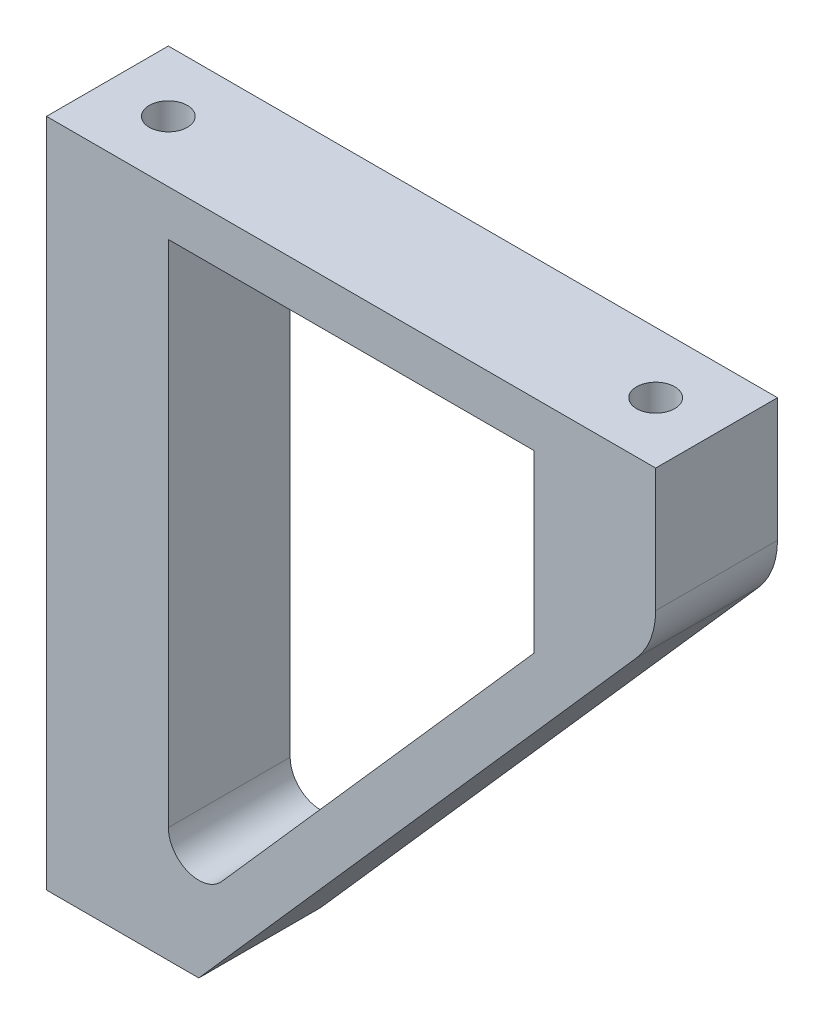
ISO-10303-21;
HEADER;
FILE_DESCRIPTION(('STEP AP214'),'2;1');
FILE_NAME('part.step','',(''),(''),'','','');
FILE_SCHEMA(('AUTOMOTIVE_DESIGN { 1 0 10303 214 1 1 1 1 }'));
ENDSEC;
DATA;
#1=APPLICATION_CONTEXT('core data for automotive mechanical design processes');
#2=APPLICATION_PROTOCOL_DEFINITION('international standard','automotive_design',2000,#1);
#3=PRODUCT_CONTEXT('',#1,'mechanical');
#4=PRODUCT('Part','Part','',(#3));
#5=PRODUCT_RELATED_PRODUCT_CATEGORY('part','',(#4));
#6=PRODUCT_DEFINITION_FORMATION('','',#4);
#7=PRODUCT_DEFINITION_CONTEXT('part definition',#1,'design');
#8=PRODUCT_DEFINITION('design','',#6,#7);
#9=PRODUCT_DEFINITION_SHAPE('','',#8);
#10=(LENGTH_UNIT() NAMED_UNIT(*) SI_UNIT(.MILLI.,.METRE.));
#11=(NAMED_UNIT(*) PLANE_ANGLE_UNIT() SI_UNIT($,.RADIAN.));
#12=(NAMED_UNIT(*) SI_UNIT($,.STERADIAN.) SOLID_ANGLE_UNIT());
#13=UNCERTAINTY_MEASURE_WITH_UNIT(LENGTH_MEASURE(1.E-05),#10,'distance_accuracy_value','');
#14=(GEOMETRIC_REPRESENTATION_CONTEXT(3) GLOBAL_UNCERTAINTY_ASSIGNED_CONTEXT((#13)) GLOBAL_UNIT_ASSIGNED_CONTEXT((#10,
#11,#12)) REPRESENTATION_CONTEXT('',''));
#15=CARTESIAN_POINT('',(0.,0.,0.));
#16=DIRECTION('',(0.,0.,1.));
#17=DIRECTION('',(1.,0.,0.));
#18=AXIS2_PLACEMENT_3D('',#15,#16,#17);
#19=CARTESIAN_POINT('',(0.,0.,8.));
#20=DIRECTION('',(0.,0.,1.));
#21=DIRECTION('',(1.,0.,0.));
#22=AXIS2_PLACEMENT_3D('',#19,#20,#21);
#23=PLANE('',#22);
#24=DIRECTION('',(0.661621637086846,0.749837855365092,0.));
#25=VECTOR('',#24,1.);
#26=CARTESIAN_POINT('',(-10.,-22.,8.));
#27=LINE('',#26,#25);
#28=CARTESIAN_POINT('',(-10.,-22.,8.));
#29=VERTEX_POINT('',#28);
#30=CARTESIAN_POINT('',(18.7491892768255,10.5824145137355,8.));
#31=VERTEX_POINT('',#30);
#32=EDGE_CURVE('E177',#29,#31,#27,.T.);
#33=ORIENTED_EDGE('',*,*,#32,.T.);
#34=CARTESIAN_POINT('',(15.,13.8905226991698,8.));
#35=DIRECTION('',(0.,0.,1.));
#36=DIRECTION('',(1.,0.,0.));
#37=AXIS2_PLACEMENT_3D('',#34,#35,#36);
#38=CIRCLE('',#37,5.);
#39=CARTESIAN_POINT('',(20.,13.8905226991697,8.));
#40=VERTEX_POINT('',#39);
#41=EDGE_CURVE('E11',#31,#40,#38,.T.);
#42=ORIENTED_EDGE('',*,*,#41,.T.);
#43=DIRECTION('',(0.,1.,0.));
#44=VECTOR('',#43,1.);
#45=CARTESIAN_POINT('',(20.,12.,8.));
#46=LINE('',#45,#44);
#47=CARTESIAN_POINT('',(20.,22.,8.));
#48=VERTEX_POINT('',#47);
#49=EDGE_CURVE('E179',#40,#48,#46,.T.);
#50=ORIENTED_EDGE('',*,*,#49,.T.);
#51=DIRECTION('',(-1.,0.,0.));
#52=VECTOR('',#51,1.);
#53=CARTESIAN_POINT('',(20.,22.,8.));
#54=LINE('',#53,#52);
#55=CARTESIAN_POINT('',(-20.,22.,8.));
#56=VERTEX_POINT('',#55);
#57=EDGE_CURVE('E169',#48,#56,#54,.T.);
#58=ORIENTED_EDGE('',*,*,#57,.T.);
#59=DIRECTION('',(0.,-1.,0.));
#60=VECTOR('',#59,1.);
#61=CARTESIAN_POINT('',(-20.,22.,8.));
#62=LINE('',#61,#60);
#63=CARTESIAN_POINT('',(-20.,-22.,8.));
#64=VERTEX_POINT('',#63);
#65=EDGE_CURVE('E172',#56,#64,#62,.T.);
#66=ORIENTED_EDGE('',*,*,#65,.T.);
#67=DIRECTION('',(1.,0.,0.));
#68=VECTOR('',#67,1.);
#69=CARTESIAN_POINT('',(-20.,-22.,8.));
#70=LINE('',#69,#68);
#71=EDGE_CURVE('E175',#64,#29,#70,.T.);
#72=ORIENTED_EDGE('',*,*,#71,.T.);
#73=EDGE_LOOP('',(#33,#42,#50,#58,#66,#72));
#74=FACE_BOUND('',#73,.T.);
#75=DIRECTION('',(0.,-1.,0.));
#76=VECTOR('',#75,1.);
#77=CARTESIAN_POINT('',(-12.,19.,8.));
#78=LINE('',#77,#76);
#79=CARTESIAN_POINT('',(-12.,19.,8.));
#80=VERTEX_POINT('',#79);
#81=CARTESIAN_POINT('',(-12.,-14.4428106341636,8.));
#82=VERTEX_POINT('',#81);
#83=EDGE_CURVE('E128',#80,#82,#78,.T.);
#84=ORIENTED_EDGE('',*,*,#83,.F.);
#85=DIRECTION('',(-1.,0.,0.));
#86=VECTOR('',#85,1.);
#87=CARTESIAN_POINT('',(12.,19.,8.));
#88=LINE('',#87,#86);
#89=CARTESIAN_POINT('',(12.,19.,8.));
#90=VERTEX_POINT('',#89);
#91=EDGE_CURVE('E118',#90,#80,#88,.T.);
#92=ORIENTED_EDGE('',*,*,#91,.F.);
#93=DIRECTION('',(0.,1.,0.));
#94=VECTOR('',#93,1.);
#95=CARTESIAN_POINT('',(12.,7.4676469528352,8.));
#96=LINE('',#95,#94);
#97=CARTESIAN_POINT('',(12.,7.4676469528352,8.));
#98=VERTEX_POINT('',#97);
#99=EDGE_CURVE('E149',#98,#90,#96,.T.);
#100=ORIENTED_EDGE('',*,*,#99,.F.);
#101=DIRECTION('',(0.661621637086846,0.749837855365092,0.));
#102=VECTOR('',#101,1.);
#103=CARTESIAN_POINT('',(-8.50032428926981,-15.7660539083373,8.));
#104=LINE('',#103,#102);
#105=CARTESIAN_POINT('',(-8.50032428926981,-15.7660539083373,8.));
#106=VERTEX_POINT('',#105);
#107=EDGE_CURVE('E143',#106,#98,#104,.T.);
#108=ORIENTED_EDGE('',*,*,#107,.F.);
#109=CARTESIAN_POINT('',(-10.,-14.4428106341636,8.));
#110=DIRECTION('',(0.,0.,1.));
#111=DIRECTION('',(1.,0.,0.));
#112=AXIS2_PLACEMENT_3D('',#109,#110,#111);
#113=CIRCLE('',#112,2.);
#114=EDGE_CURVE('E141',#82,#106,#113,.T.);
#115=ORIENTED_EDGE('',*,*,#114,.F.);
#116=EDGE_LOOP('',(#84,#92,#100,#108,#115));
#117=FACE_BOUND('',#116,.T.);
#118=ADVANCED_FACE('F34',(#74,#117),#23,.T.);
#119=CARTESIAN_POINT('',(0.,0.,0.));
#120=DIRECTION('',(0.,0.,1.));
#121=DIRECTION('',(1.,0.,0.));
#122=AXIS2_PLACEMENT_3D('',#119,#120,#121);
#123=PLANE('',#122);
#124=DIRECTION('',(0.,1.,0.));
#125=VECTOR('',#124,1.);
#126=CARTESIAN_POINT('',(20.,12.,0.));
#127=LINE('',#126,#125);
#128=CARTESIAN_POINT('',(20.,13.8905226991697,0.));
#129=VERTEX_POINT('',#128);
#130=CARTESIAN_POINT('',(20.,22.,0.));
#131=VERTEX_POINT('',#130);
#132=EDGE_CURVE('E173',#129,#131,#127,.T.);
#133=ORIENTED_EDGE('',*,*,#132,.F.);
#134=CARTESIAN_POINT('',(15.,13.8905226991698,0.));
#135=DIRECTION('',(0.,0.,1.));
#136=DIRECTION('',(1.,0.,0.));
#137=AXIS2_PLACEMENT_3D('',#134,#135,#136);
#138=CIRCLE('',#137,5.);
#139=CARTESIAN_POINT('',(18.7491892768255,10.5824145137355,0.));
#140=VERTEX_POINT('',#139);
#141=EDGE_CURVE('E56',#129,#140,#138,.F.);
#142=ORIENTED_EDGE('',*,*,#141,.T.);
#143=DIRECTION('',(0.661621637086846,0.749837855365092,0.));
#144=VECTOR('',#143,1.);
#145=CARTESIAN_POINT('',(-10.,-22.,0.));
#146=LINE('',#145,#144);
#147=CARTESIAN_POINT('',(-10.,-22.,0.));
#148=VERTEX_POINT('',#147);
#149=EDGE_CURVE('E188',#148,#140,#146,.T.);
#150=ORIENTED_EDGE('',*,*,#149,.F.);
#151=DIRECTION('',(1.,0.,0.));
#152=VECTOR('',#151,1.);
#153=CARTESIAN_POINT('',(-20.,-22.,0.));
#154=LINE('',#153,#152);
#155=CARTESIAN_POINT('',(-20.,-22.,0.));
#156=VERTEX_POINT('',#155);
#157=EDGE_CURVE('E186',#156,#148,#154,.T.);
#158=ORIENTED_EDGE('',*,*,#157,.F.);
#159=DIRECTION('',(0.,-1.,0.));
#160=VECTOR('',#159,1.);
#161=CARTESIAN_POINT('',(-20.,22.,0.));
#162=LINE('',#161,#160);
#163=CARTESIAN_POINT('',(-20.,22.,0.));
#164=VERTEX_POINT('',#163);
#165=EDGE_CURVE('E184',#164,#156,#162,.T.);
#166=ORIENTED_EDGE('',*,*,#165,.F.);
#167=DIRECTION('',(-1.,0.,0.));
#168=VECTOR('',#167,1.);
#169=CARTESIAN_POINT('',(20.,22.,0.));
#170=LINE('',#169,#168);
#171=EDGE_CURVE('E136',#131,#164,#170,.T.);
#172=ORIENTED_EDGE('',*,*,#171,.F.);
#173=EDGE_LOOP('',(#133,#142,#150,#158,#166,#172));
#174=FACE_BOUND('',#173,.T.);
#175=DIRECTION('',(-1.,0.,0.));
#176=VECTOR('',#175,1.);
#177=CARTESIAN_POINT('',(12.,19.,0.));
#178=LINE('',#177,#176);
#179=CARTESIAN_POINT('',(12.,19.,0.));
#180=VERTEX_POINT('',#179);
#181=CARTESIAN_POINT('',(-12.,19.,0.));
#182=VERTEX_POINT('',#181);
#183=EDGE_CURVE('E151',#180,#182,#178,.T.);
#184=ORIENTED_EDGE('',*,*,#183,.T.);
#185=DIRECTION('',(0.,-1.,0.));
#186=VECTOR('',#185,1.);
#187=CARTESIAN_POINT('',(-12.,19.,0.));
#188=LINE('',#187,#186);
#189=CARTESIAN_POINT('',(-12.,-14.4428106341636,0.));
#190=VERTEX_POINT('',#189);
#191=EDGE_CURVE('E135',#182,#190,#188,.T.);
#192=ORIENTED_EDGE('',*,*,#191,.T.);
#193=CARTESIAN_POINT('',(-10.,-14.4428106341636,0.));
#194=DIRECTION('',(0.,0.,1.));
#195=DIRECTION('',(1.,0.,0.));
#196=AXIS2_PLACEMENT_3D('',#193,#194,#195);
#197=CIRCLE('',#196,2.);
#198=CARTESIAN_POINT('',(-8.50032428926981,-15.7660539083373,0.));
#199=VERTEX_POINT('',#198);
#200=EDGE_CURVE('E155',#190,#199,#197,.T.);
#201=ORIENTED_EDGE('',*,*,#200,.T.);
#202=DIRECTION('',(0.661621637086846,0.749837855365092,0.));
#203=VECTOR('',#202,1.);
#204=CARTESIAN_POINT('',(-8.50032428926981,-15.7660539083373,0.));
#205=LINE('',#204,#203);
#206=CARTESIAN_POINT('',(12.,7.4676469528352,0.));
#207=VERTEX_POINT('',#206);
#208=EDGE_CURVE('E158',#199,#207,#205,.T.);
#209=ORIENTED_EDGE('',*,*,#208,.T.);
#210=DIRECTION('',(0.,1.,0.));
#211=VECTOR('',#210,1.);
#212=CARTESIAN_POINT('',(12.,7.4676469528352,0.));
#213=LINE('',#212,#211);
#214=EDGE_CURVE('E129',#207,#180,#213,.T.);
#215=ORIENTED_EDGE('',*,*,#214,.T.);
#216=EDGE_LOOP('',(#184,#192,#201,#209,#215));
#217=FACE_BOUND('',#216,.T.);
#218=ADVANCED_FACE('F213',(#174,#217),#123,.F.);
#219=CARTESIAN_POINT('',(20.,22.,8.));
#220=DIRECTION('',(0.,-1.,0.));
#221=DIRECTION('',(0.,0.,-1.));
#222=AXIS2_PLACEMENT_3D('',#219,#220,#221);
#223=PLANE('',#222);
#224=CARTESIAN_POINT('',(-16.,22.,4.));
#225=DIRECTION('',(0.,-1.,0.));
#226=DIRECTION('',(1.,0.,0.));
#227=AXIS2_PLACEMENT_3D('',#224,#225,#226);
#228=CIRCLE('',#227,1.25);
#229=CARTESIAN_POINT('',(-17.25,22.,4.));
#230=VERTEX_POINT('',#229);
#231=EDGE_CURVE('E263',#230,#230,#228,.T.);
#232=ORIENTED_EDGE('',*,*,#231,.T.);
#233=EDGE_LOOP('',(#232));
#234=FACE_BOUND('',#233,.T.);
#235=CARTESIAN_POINT('',(16.,22.,4.));
#236=DIRECTION('',(0.,1.,0.));
#237=DIRECTION('',(0.,0.,1.));
#238=AXIS2_PLACEMENT_3D('',#235,#236,#237);
#239=CIRCLE('',#238,1.25);
#240=CARTESIAN_POINT('',(16.,22.,5.25));
#241=VERTEX_POINT('',#240);
#242=EDGE_CURVE('E266',#241,#241,#239,.T.);
#243=ORIENTED_EDGE('',*,*,#242,.F.);
#244=EDGE_LOOP('',(#243));
#245=FACE_BOUND('',#244,.T.);
#246=ORIENTED_EDGE('',*,*,#171,.T.);
#247=DIRECTION('',(0.,0.,-1.));
#248=VECTOR('',#247,1.);
#249=CARTESIAN_POINT('',(-20.,22.,8.));
#250=LINE('',#249,#248);
#251=EDGE_CURVE('E199',#56,#164,#250,.T.);
#252=ORIENTED_EDGE('',*,*,#251,.F.);
#253=ORIENTED_EDGE('',*,*,#57,.F.);
#254=DIRECTION('',(0.,0.,-1.));
#255=VECTOR('',#254,1.);
#256=CARTESIAN_POINT('',(20.,22.,8.));
#257=LINE('',#256,#255);
#258=EDGE_CURVE('E181',#48,#131,#257,.T.);
#259=ORIENTED_EDGE('',*,*,#258,.T.);
#260=EDGE_LOOP('',(#246,#252,#253,#259));
#261=FACE_BOUND('',#260,.T.);
#262=ADVANCED_FACE('F218',(#234,#245,#261),#223,.F.);
#263=CARTESIAN_POINT('',(-20.,22.,8.));
#264=DIRECTION('',(1.,0.,0.));
#265=DIRECTION('',(0.,0.,-1.));
#266=AXIS2_PLACEMENT_3D('',#263,#264,#265);
#267=PLANE('',#266);
#268=ORIENTED_EDGE('',*,*,#165,.T.);
#269=DIRECTION('',(0.,0.,-1.));
#270=VECTOR('',#269,1.);
#271=CARTESIAN_POINT('',(-20.,-22.,8.));
#272=LINE('',#271,#270);
#273=EDGE_CURVE('E196',#64,#156,#272,.T.);
#274=ORIENTED_EDGE('',*,*,#273,.F.);
#275=ORIENTED_EDGE('',*,*,#65,.F.);
#276=ORIENTED_EDGE('',*,*,#251,.T.);
#277=EDGE_LOOP('',(#268,#274,#275,#276));
#278=FACE_BOUND('',#277,.T.);
#279=ADVANCED_FACE('F252',(#278),#267,.F.);
#280=CARTESIAN_POINT('',(-20.,-22.,8.));
#281=DIRECTION('',(0.,1.,0.));
#282=DIRECTION('',(0.,0.,1.));
#283=AXIS2_PLACEMENT_3D('',#280,#281,#282);
#284=PLANE('',#283);
#285=CARTESIAN_POINT('',(-16.,-22.,4.));
#286=DIRECTION('',(0.,-1.,0.));
#287=DIRECTION('',(1.,0.,0.));
#288=AXIS2_PLACEMENT_3D('',#285,#286,#287);
#289=CIRCLE('',#288,1.25);
#290=CARTESIAN_POINT('',(-14.75,-22.,4.));
#291=VERTEX_POINT('',#290);
#292=EDGE_CURVE('E272',#291,#291,#289,.T.);
#293=ORIENTED_EDGE('',*,*,#292,.F.);
#294=EDGE_LOOP('',(#293));
#295=FACE_BOUND('',#294,.T.);
#296=ORIENTED_EDGE('',*,*,#157,.T.);
#297=DIRECTION('',(0.,0.,-1.));
#298=VECTOR('',#297,1.);
#299=CARTESIAN_POINT('',(-10.,-22.,8.));
#300=LINE('',#299,#298);
#301=EDGE_CURVE('E193',#29,#148,#300,.T.);
#302=ORIENTED_EDGE('',*,*,#301,.F.);
#303=ORIENTED_EDGE('',*,*,#71,.F.);
#304=ORIENTED_EDGE('',*,*,#273,.T.);
#305=EDGE_LOOP('',(#296,#302,#303,#304));
#306=FACE_BOUND('',#305,.T.);
#307=ADVANCED_FACE('F249',(#295,#306),#284,.F.);
#308=CARTESIAN_POINT('',(-10.,-22.,8.));
#309=DIRECTION('',(-0.749837855365092,0.661621637086846,0.));
#310=DIRECTION('',(-0.661621637086847,-0.749837855365093,0.));
#311=AXIS2_PLACEMENT_3D('',#308,#309,#310);
#312=PLANE('',#311);
#313=ORIENTED_EDGE('',*,*,#149,.T.);
#314=DIRECTION('',(0.,0.,-1.));
#315=VECTOR('',#314,1.);
#316=CARTESIAN_POINT('',(18.7491892768255,10.5824145137355,8.));
#317=LINE('',#316,#315);
#318=EDGE_CURVE('E42',#140,#31,#317,.F.);
#319=ORIENTED_EDGE('',*,*,#318,.T.);
#320=ORIENTED_EDGE('',*,*,#32,.F.);
#321=ORIENTED_EDGE('',*,*,#301,.T.);
#322=EDGE_LOOP('',(#313,#319,#320,#321));
#323=FACE_BOUND('',#322,.T.);
#324=ADVANCED_FACE('F246',(#323),#312,.F.);
#325=CARTESIAN_POINT('',(20.,12.,8.));
#326=DIRECTION('',(-1.,0.,0.));
#327=DIRECTION('',(0.,-1.,0.));
#328=AXIS2_PLACEMENT_3D('',#325,#326,#327);
#329=PLANE('',#328);
#330=ORIENTED_EDGE('',*,*,#49,.F.);
#331=DIRECTION('',(0.,0.,-1.));
#332=VECTOR('',#331,1.);
#333=CARTESIAN_POINT('',(20.,13.8905226991697,8.));
#334=LINE('',#333,#332);
#335=EDGE_CURVE('E202',#40,#129,#334,.T.);
#336=ORIENTED_EDGE('',*,*,#335,.T.);
#337=ORIENTED_EDGE('',*,*,#132,.T.);
#338=ORIENTED_EDGE('',*,*,#258,.F.);
#339=EDGE_LOOP('',(#330,#336,#337,#338));
#340=FACE_BOUND('',#339,.T.);
#341=ADVANCED_FACE('F208',(#340),#329,.F.);
#342=CARTESIAN_POINT('',(12.,19.,8.));
#343=DIRECTION('',(0.,-1.,0.));
#344=DIRECTION('',(0.,0.,-1.));
#345=AXIS2_PLACEMENT_3D('',#342,#343,#344);
#346=PLANE('',#345);
#347=ORIENTED_EDGE('',*,*,#183,.F.);
#348=DIRECTION('',(0.,0.,-1.));
#349=VECTOR('',#348,1.);
#350=CARTESIAN_POINT('',(12.,19.,8.));
#351=LINE('',#350,#349);
#352=EDGE_CURVE('E124',#90,#180,#351,.T.);
#353=ORIENTED_EDGE('',*,*,#352,.F.);
#354=ORIENTED_EDGE('',*,*,#91,.T.);
#355=DIRECTION('',(0.,0.,-1.));
#356=VECTOR('',#355,1.);
#357=CARTESIAN_POINT('',(-12.,19.,8.));
#358=LINE('',#357,#356);
#359=EDGE_CURVE('E121',#80,#182,#358,.T.);
#360=ORIENTED_EDGE('',*,*,#359,.T.);
#361=EDGE_LOOP('',(#347,#353,#354,#360));
#362=FACE_BOUND('',#361,.T.);
#363=ADVANCED_FACE('F120',(#362),#346,.T.);
#364=CARTESIAN_POINT('',(-12.,19.,8.));
#365=DIRECTION('',(1.,0.,0.));
#366=DIRECTION('',(0.,1.,0.));
#367=AXIS2_PLACEMENT_3D('',#364,#365,#366);
#368=PLANE('',#367);
#369=ORIENTED_EDGE('',*,*,#191,.F.);
#370=ORIENTED_EDGE('',*,*,#359,.F.);
#371=ORIENTED_EDGE('',*,*,#83,.T.);
#372=DIRECTION('',(0.,0.,-1.));
#373=VECTOR('',#372,1.);
#374=CARTESIAN_POINT('',(-12.,-14.4428106341636,8.));
#375=LINE('',#374,#373);
#376=EDGE_CURVE('E137',#82,#190,#375,.T.);
#377=ORIENTED_EDGE('',*,*,#376,.T.);
#378=EDGE_LOOP('',(#369,#370,#371,#377));
#379=FACE_BOUND('',#378,.T.);
#380=ADVANCED_FACE('F132',(#379),#368,.T.);
#381=CARTESIAN_POINT('',(-10.,-14.4428106341636,8.));
#382=DIRECTION('',(0.,0.,-1.));
#383=DIRECTION('',(-1.,0.,0.));
#384=AXIS2_PLACEMENT_3D('',#381,#382,#383);
#385=CYLINDRICAL_SURFACE('',#384,2.);
#386=ORIENTED_EDGE('',*,*,#200,.F.);
#387=ORIENTED_EDGE('',*,*,#376,.F.);
#388=ORIENTED_EDGE('',*,*,#114,.T.);
#389=DIRECTION('',(0.,0.,-1.));
#390=VECTOR('',#389,1.);
#391=CARTESIAN_POINT('',(-8.50032428926981,-15.7660539083373,8.));
#392=LINE('',#391,#390);
#393=EDGE_CURVE('E166',#106,#199,#392,.T.);
#394=ORIENTED_EDGE('',*,*,#393,.T.);
#395=EDGE_LOOP('',(#386,#387,#388,#394));
#396=FACE_BOUND('',#395,.T.);
#397=ADVANCED_FACE('F305',(#396),#385,.F.);
#398=CARTESIAN_POINT('',(-8.50032428926981,-15.7660539083373,8.));
#399=DIRECTION('',(-0.749837855365093,0.661621637086847,0.));
#400=DIRECTION('',(-0.661621637086847,-0.749837855365093,0.));
#401=AXIS2_PLACEMENT_3D('',#398,#399,#400);
#402=PLANE('',#401);
#403=ORIENTED_EDGE('',*,*,#208,.F.);
#404=ORIENTED_EDGE('',*,*,#393,.F.);
#405=ORIENTED_EDGE('',*,*,#107,.T.);
#406=DIRECTION('',(0.,0.,-1.));
#407=VECTOR('',#406,1.);
#408=CARTESIAN_POINT('',(12.,7.4676469528352,8.));
#409=LINE('',#408,#407);
#410=EDGE_CURVE('E164',#98,#207,#409,.T.);
#411=ORIENTED_EDGE('',*,*,#410,.T.);
#412=EDGE_LOOP('',(#403,#404,#405,#411));
#413=FACE_BOUND('',#412,.T.);
#414=ADVANCED_FACE('F297',(#413),#402,.T.);
#415=CARTESIAN_POINT('',(12.,7.4676469528352,8.));
#416=DIRECTION('',(-1.,0.,0.));
#417=DIRECTION('',(0.,-1.,0.));
#418=AXIS2_PLACEMENT_3D('',#415,#416,#417);
#419=PLANE('',#418);
#420=ORIENTED_EDGE('',*,*,#214,.F.);
#421=ORIENTED_EDGE('',*,*,#410,.F.);
#422=ORIENTED_EDGE('',*,*,#99,.T.);
#423=ORIENTED_EDGE('',*,*,#352,.T.);
#424=EDGE_LOOP('',(#420,#421,#422,#423));
#425=FACE_BOUND('',#424,.T.);
#426=ADVANCED_FACE('F288',(#425),#419,.T.);
#427=CARTESIAN_POINT('',(-16.,-9.00000000000001,4.));
#428=DIRECTION('',(0.,-1.,0.));
#429=DIRECTION('',(1.,0.,0.));
#430=AXIS2_PLACEMENT_3D('',#427,#428,#429);
#431=CYLINDRICAL_SURFACE('',#430,1.25);
#432=CARTESIAN_POINT('',(-16.,-9.00000000000001,4.));
#433=DIRECTION('',(0.,-1.,0.));
#434=DIRECTION('',(1.,0.,0.));
#435=AXIS2_PLACEMENT_3D('',#432,#433,#434);
#436=CIRCLE('',#435,1.25);
#437=CARTESIAN_POINT('',(-14.75,-9.00000000000001,4.));
#438=VERTEX_POINT('',#437);
#439=EDGE_CURVE('E153',#438,#438,#436,.T.);
#440=CARTESIAN_POINT('',(-14.75,-9.00000000000001,4.));
#441=CARTESIAN_POINT('',(-14.75,-9.13541666666667,4.));
#442=CARTESIAN_POINT('',(-14.75,-9.27083333333334,4.));
#443=CARTESIAN_POINT('',(-14.75,-9.54166666666667,4.));
#444=CARTESIAN_POINT('',(-14.75,-9.67708333333334,4.));
#445=CARTESIAN_POINT('',(-14.75,-9.94791666666668,4.));
#446=CARTESIAN_POINT('',(-14.75,-10.0833333333333,4.));
#447=CARTESIAN_POINT('',(-14.75,-10.3541666666667,4.));
#448=CARTESIAN_POINT('',(-14.75,-10.4895833333333,4.));
#449=CARTESIAN_POINT('',(-14.75,-10.7604166666667,4.));
#450=CARTESIAN_POINT('',(-14.75,-10.8958333333333,4.));
#451=CARTESIAN_POINT('',(-14.75,-11.1666666666667,4.));
#452=CARTESIAN_POINT('',(-14.75,-11.3020833333333,4.));
#453=CARTESIAN_POINT('',(-14.75,-11.5729166666667,4.));
#454=CARTESIAN_POINT('',(-14.75,-11.7083333333333,4.));
#455=CARTESIAN_POINT('',(-14.75,-11.9791666666667,4.));
#456=CARTESIAN_POINT('',(-14.75,-12.1145833333333,4.));
#457=CARTESIAN_POINT('',(-14.75,-12.3854166666667,4.));
#458=CARTESIAN_POINT('',(-14.75,-12.5208333333333,4.));
#459=CARTESIAN_POINT('',(-14.75,-12.7916666666667,4.));
#460=CARTESIAN_POINT('',(-14.75,-12.9270833333333,4.));
#461=CARTESIAN_POINT('',(-14.75,-13.1979166666667,4.));
#462=CARTESIAN_POINT('',(-14.75,-13.3333333333333,4.));
#463=CARTESIAN_POINT('',(-14.75,-13.6041666666667,4.));
#464=CARTESIAN_POINT('',(-14.75,-13.7395833333333,4.));
#465=CARTESIAN_POINT('',(-14.75,-14.0104166666667,4.));
#466=CARTESIAN_POINT('',(-14.75,-14.1458333333333,4.));
#467=CARTESIAN_POINT('',(-14.75,-14.4166666666667,4.));
#468=CARTESIAN_POINT('',(-14.75,-14.5520833333333,4.));
#469=CARTESIAN_POINT('',(-14.75,-14.8229166666667,4.));
#470=CARTESIAN_POINT('',(-14.75,-14.9583333333333,4.));
#471=CARTESIAN_POINT('',(-14.75,-15.2291666666667,4.));
#472=CARTESIAN_POINT('',(-14.75,-15.3645833333333,4.));
#473=CARTESIAN_POINT('',(-14.75,-15.6354166666667,4.));
#474=CARTESIAN_POINT('',(-14.75,-15.7708333333333,4.));
#475=CARTESIAN_POINT('',(-14.75,-16.0416666666667,4.));
#476=CARTESIAN_POINT('',(-14.75,-16.1770833333333,4.));
#477=CARTESIAN_POINT('',(-14.75,-16.4479166666667,4.));
#478=CARTESIAN_POINT('',(-14.75,-16.5833333333333,4.));
#479=CARTESIAN_POINT('',(-14.75,-16.8541666666667,4.));
#480=CARTESIAN_POINT('',(-14.75,-16.9895833333333,4.));
#481=CARTESIAN_POINT('',(-14.75,-17.2604166666667,4.));
#482=CARTESIAN_POINT('',(-14.75,-17.3958333333333,4.));
#483=CARTESIAN_POINT('',(-14.75,-17.6666666666667,4.));
#484=CARTESIAN_POINT('',(-14.75,-17.8020833333333,4.));
#485=CARTESIAN_POINT('',(-14.75,-18.0729166666667,4.));
#486=CARTESIAN_POINT('',(-14.75,-18.2083333333333,4.));
#487=CARTESIAN_POINT('',(-14.75,-18.4791666666667,4.));
#488=CARTESIAN_POINT('',(-14.75,-18.6145833333333,4.));
#489=CARTESIAN_POINT('',(-14.75,-18.8854166666667,4.));
#490=CARTESIAN_POINT('',(-14.75,-19.0208333333333,4.));
#491=CARTESIAN_POINT('',(-14.75,-19.2916666666667,4.));
#492=CARTESIAN_POINT('',(-14.75,-19.4270833333333,4.));
#493=CARTESIAN_POINT('',(-14.75,-19.6979166666667,4.));
#494=CARTESIAN_POINT('',(-14.75,-19.8333333333333,4.));
#495=CARTESIAN_POINT('',(-14.75,-20.1041666666667,4.));
#496=CARTESIAN_POINT('',(-14.75,-20.2395833333333,4.));
#497=CARTESIAN_POINT('',(-14.75,-20.5104166666667,4.));
#498=CARTESIAN_POINT('',(-14.75,-20.6458333333333,4.));
#499=CARTESIAN_POINT('',(-14.75,-20.9166666666667,4.));
#500=CARTESIAN_POINT('',(-14.75,-21.0520833333333,4.));
#501=CARTESIAN_POINT('',(-14.75,-21.3229166666667,4.));
#502=CARTESIAN_POINT('',(-14.75,-21.4583333333333,4.));
#503=CARTESIAN_POINT('',(-14.75,-21.7291666666667,4.));
#504=CARTESIAN_POINT('',(-14.75,-21.8645833333333,4.));
#505=CARTESIAN_POINT('',(-14.75,-22.,4.));
#506=B_SPLINE_CURVE_WITH_KNOTS('',3,(#440,#441,#442,#443,#444,#445,#446,#447,#448,#449,#450,
#451,#452,#453,#454,#455,#456,#457,#458,#459,#460,#461,#462,#463,#464,#465,#466,#467,#468,#469,
#470,#471,#472,#473,#474,#475,#476,#477,#478,#479,#480,#481,#482,#483,#484,#485,#486,#487,#488,
#489,#490,#491,#492,#493,#494,#495,#496,#497,#498,#499,#500,#501,#502,#503,#504,#505),
.UNSPECIFIED.,.F.,.F.,(4,2,2,2,2,2,2,2,2,2,2,2,2,2,2,2,2,2,2,2,2,2,2,2,2,2,2,2,2,2,2,2,4),(0.,
0.40625,0.812500000000001,1.21875,1.625,2.03125,2.4375,2.84375,3.25,3.65625,4.0625,4.46875,
4.875,5.28125,5.6875,6.09375,6.5,6.90625,7.3125,7.71875,8.125,8.53125,8.9375,9.34375,9.75,
10.15625,10.5625,10.96875,11.375,11.78125,12.1875,12.59375,13.),.UNSPECIFIED.);
#507=EDGE_CURVE('BSEAM282',#438,#291,#506,.T.);
#508=ORIENTED_EDGE('',*,*,#439,.F.);
#509=ORIENTED_EDGE('',*,*,#292,.T.);
#510=ORIENTED_EDGE('',*,*,#507,.T.);
#511=ORIENTED_EDGE('',*,*,#507,.F.);
#512=EDGE_LOOP('',(#508,#510,#509,#511));
#513=FACE_BOUND('',#512,.T.);
#514=ADVANCED_FACE('F282',(#513),#431,.F.);
#515=CARTESIAN_POINT('',(-16.,-9.00000000000001,4.));
#516=DIRECTION('',(0.,-1.,0.));
#517=DIRECTION('',(1.,0.,0.));
#518=AXIS2_PLACEMENT_3D('',#515,#516,#517);
#519=PLANE('',#518);
#520=ORIENTED_EDGE('',*,*,#439,.T.);
#521=EDGE_LOOP('',(#520));
#522=FACE_BOUND('',#521,.T.);
#523=ADVANCED_FACE('F287',(#522),#519,.T.);
#524=CARTESIAN_POINT('',(16.,12.,4.));
#525=DIRECTION('',(0.,1.,0.));
#526=DIRECTION('',(0.,0.,1.));
#527=AXIS2_PLACEMENT_3D('',#524,#525,#526);
#528=CYLINDRICAL_SURFACE('',#527,1.25);
#529=CARTESIAN_POINT('',(16.,12.,4.));
#530=DIRECTION('',(0.,1.,0.));
#531=DIRECTION('',(0.,0.,1.));
#532=AXIS2_PLACEMENT_3D('',#529,#530,#531);
#533=CIRCLE('',#532,1.25);
#534=CARTESIAN_POINT('',(16.,12.,5.25));
#535=VERTEX_POINT('',#534);
#536=EDGE_CURVE('E268',#535,#535,#533,.T.);
#537=ORIENTED_EDGE('',*,*,#536,.F.);
#538=EDGE_LOOP('',(#537));
#539=FACE_BOUND('',#538,.T.);
#540=ORIENTED_EDGE('',*,*,#242,.T.);
#541=EDGE_LOOP('',(#540));
#542=FACE_BOUND('',#541,.T.);
#543=ADVANCED_FACE('F232',(#539,#542),#528,.F.);
#544=CARTESIAN_POINT('',(16.,12.,4.));
#545=DIRECTION('',(0.,1.,0.));
#546=DIRECTION('',(0.,0.,1.));
#547=AXIS2_PLACEMENT_3D('',#544,#545,#546);
#548=PLANE('',#547);
#549=ORIENTED_EDGE('',*,*,#536,.T.);
#550=EDGE_LOOP('',(#549));
#551=FACE_BOUND('',#550,.T.);
#552=ADVANCED_FACE('F224',(#551),#548,.T.);
#553=CARTESIAN_POINT('',(15.,13.8905226991698,8.));
#554=DIRECTION('',(0.,0.,-1.));
#555=DIRECTION('',(-1.,0.,0.));
#556=AXIS2_PLACEMENT_3D('',#553,#554,#555);
#557=CYLINDRICAL_SURFACE('',#556,5.);
#558=ORIENTED_EDGE('',*,*,#41,.F.);
#559=ORIENTED_EDGE('',*,*,#318,.F.);
#560=ORIENTED_EDGE('',*,*,#141,.F.);
#561=ORIENTED_EDGE('',*,*,#335,.F.);
#562=EDGE_LOOP('',(#558,#559,#560,#561));
#563=FACE_BOUND('',#562,.T.);
#564=ADVANCED_FACE('F36',(#563),#557,.T.);
#565=CARTESIAN_POINT('',(-16.,9.00000000000001,4.));
#566=DIRECTION('',(0.,1.,0.));
#567=DIRECTION('',(-1.,0.,0.));
#568=AXIS2_PLACEMENT_3D('',#565,#566,#567);
#569=CYLINDRICAL_SURFACE('',#568,1.25);
#570=CARTESIAN_POINT('',(-16.,9.00000000000001,4.));
#571=DIRECTION('',(0.,-1.,0.));
#572=DIRECTION('',(1.,0.,0.));
#573=AXIS2_PLACEMENT_3D('',#570,#571,#572);
#574=CIRCLE('',#573,1.25);
#575=CARTESIAN_POINT('',(-17.25,9.00000000000001,4.));
#576=VERTEX_POINT('',#575);
#577=EDGE_CURVE('E269',#576,#576,#574,.T.);
#578=CARTESIAN_POINT('',(-17.25,9.00000000000001,4.));
#579=CARTESIAN_POINT('',(-17.25,9.13541666666668,4.));
#580=CARTESIAN_POINT('',(-17.25,9.27083333333334,4.));
#581=CARTESIAN_POINT('',(-17.25,9.54166666666668,4.));
#582=CARTESIAN_POINT('',(-17.25,9.67708333333334,4.));
#583=CARTESIAN_POINT('',(-17.25,9.94791666666668,4.));
#584=CARTESIAN_POINT('',(-17.25,10.0833333333333,4.));
#585=CARTESIAN_POINT('',(-17.25,10.3541666666667,4.));
#586=CARTESIAN_POINT('',(-17.25,10.4895833333333,4.));
#587=CARTESIAN_POINT('',(-17.25,10.7604166666667,4.));
#588=CARTESIAN_POINT('',(-17.25,10.8958333333333,4.));
#589=CARTESIAN_POINT('',(-17.25,11.1666666666667,4.));
#590=CARTESIAN_POINT('',(-17.25,11.3020833333333,4.));
#591=CARTESIAN_POINT('',(-17.25,11.5729166666667,4.));
#592=CARTESIAN_POINT('',(-17.25,11.7083333333333,4.));
#593=CARTESIAN_POINT('',(-17.25,11.9791666666667,4.));
#594=CARTESIAN_POINT('',(-17.25,12.1145833333333,4.));
#595=CARTESIAN_POINT('',(-17.25,12.3854166666667,4.));
#596=CARTESIAN_POINT('',(-17.25,12.5208333333333,4.));
#597=CARTESIAN_POINT('',(-17.25,12.7916666666667,4.));
#598=CARTESIAN_POINT('',(-17.25,12.9270833333333,4.));
#599=CARTESIAN_POINT('',(-17.25,13.1979166666667,4.));
#600=CARTESIAN_POINT('',(-17.25,13.3333333333333,4.));
#601=CARTESIAN_POINT('',(-17.25,13.6041666666667,4.));
#602=CARTESIAN_POINT('',(-17.25,13.7395833333333,4.));
#603=CARTESIAN_POINT('',(-17.25,14.0104166666667,4.));
#604=CARTESIAN_POINT('',(-17.25,14.1458333333333,4.));
#605=CARTESIAN_POINT('',(-17.25,14.4166666666667,4.));
#606=CARTESIAN_POINT('',(-17.25,14.5520833333333,4.));
#607=CARTESIAN_POINT('',(-17.25,14.8229166666667,4.));
#608=CARTESIAN_POINT('',(-17.25,14.9583333333333,4.));
#609=CARTESIAN_POINT('',(-17.25,15.2291666666667,4.));
#610=CARTESIAN_POINT('',(-17.25,15.3645833333333,4.));
#611=CARTESIAN_POINT('',(-17.25,15.6354166666667,4.));
#612=CARTESIAN_POINT('',(-17.25,15.7708333333333,4.));
#613=CARTESIAN_POINT('',(-17.25,16.0416666666667,4.));
#614=CARTESIAN_POINT('',(-17.25,16.1770833333333,4.));
#615=CARTESIAN_POINT('',(-17.25,16.4479166666667,4.));
#616=CARTESIAN_POINT('',(-17.25,16.5833333333333,4.));
#617=CARTESIAN_POINT('',(-17.25,16.8541666666667,4.));
#618=CARTESIAN_POINT('',(-17.25,16.9895833333333,4.));
#619=CARTESIAN_POINT('',(-17.25,17.2604166666667,4.));
#620=CARTESIAN_POINT('',(-17.25,17.3958333333333,4.));
#621=CARTESIAN_POINT('',(-17.25,17.6666666666667,4.));
#622=CARTESIAN_POINT('',(-17.25,17.8020833333333,4.));
#623=CARTESIAN_POINT('',(-17.25,18.0729166666667,4.));
#624=CARTESIAN_POINT('',(-17.25,18.2083333333333,4.));
#625=CARTESIAN_POINT('',(-17.25,18.4791666666667,4.));
#626=CARTESIAN_POINT('',(-17.25,18.6145833333333,4.));
#627=CARTESIAN_POINT('',(-17.25,18.8854166666667,4.));
#628=CARTESIAN_POINT('',(-17.25,19.0208333333333,4.));
#629=CARTESIAN_POINT('',(-17.25,19.2916666666667,4.));
#630=CARTESIAN_POINT('',(-17.25,19.4270833333333,4.));
#631=CARTESIAN_POINT('',(-17.25,19.6979166666667,4.));
#632=CARTESIAN_POINT('',(-17.25,19.8333333333333,4.));
#633=CARTESIAN_POINT('',(-17.25,20.1041666666667,4.));
#634=CARTESIAN_POINT('',(-17.25,20.2395833333333,4.));
#635=CARTESIAN_POINT('',(-17.25,20.5104166666667,4.));
#636=CARTESIAN_POINT('',(-17.25,20.6458333333333,4.));
#637=CARTESIAN_POINT('',(-17.25,20.9166666666667,4.));
#638=CARTESIAN_POINT('',(-17.25,21.0520833333333,4.));
#639=CARTESIAN_POINT('',(-17.25,21.3229166666667,4.));
#640=CARTESIAN_POINT('',(-17.25,21.4583333333333,4.));
#641=CARTESIAN_POINT('',(-17.25,21.7291666666667,4.));
#642=CARTESIAN_POINT('',(-17.25,21.8645833333333,4.));
#643=CARTESIAN_POINT('',(-17.25,22.,4.));
#644=B_SPLINE_CURVE_WITH_KNOTS('',3,(#578,#579,#580,#581,#582,#583,#584,#585,#586,#587,#588,
#589,#590,#591,#592,#593,#594,#595,#596,#597,#598,#599,#600,#601,#602,#603,#604,#605,#606,#607,
#608,#609,#610,#611,#612,#613,#614,#615,#616,#617,#618,#619,#620,#621,#622,#623,#624,#625,#626,
#627,#628,#629,#630,#631,#632,#633,#634,#635,#636,#637,#638,#639,#640,#641,#642,#643),
.UNSPECIFIED.,.F.,.F.,(4,2,2,2,2,2,2,2,2,2,2,2,2,2,2,2,2,2,2,2,2,2,2,2,2,2,2,2,2,2,2,2,4),(0.,
0.40625,0.812500000000001,1.21875,1.625,2.03125,2.4375,2.84375,3.25,3.65625,4.0625,4.46875,
4.875,5.28125,5.6875,6.09375,6.5,6.90625,7.3125,7.71875,8.125,8.53125,8.9375,9.34375,9.75,
10.15625,10.5625,10.96875,11.375,11.78125,12.1875,12.59375,13.),.UNSPECIFIED.);
#645=EDGE_CURVE('BSEAM223',#576,#230,#644,.T.);
#646=ORIENTED_EDGE('',*,*,#577,.T.);
#647=ORIENTED_EDGE('',*,*,#231,.F.);
#648=ORIENTED_EDGE('',*,*,#645,.T.);
#649=ORIENTED_EDGE('',*,*,#645,.F.);
#650=EDGE_LOOP('',(#646,#648,#647,#649));
#651=FACE_BOUND('',#650,.T.);
#652=ADVANCED_FACE('F223',(#651),#569,.F.);
#653=CARTESIAN_POINT('',(-16.,9.00000000000001,4.));
#654=DIRECTION('',(0.,1.,0.));
#655=DIRECTION('',(1.,0.,0.));
#656=AXIS2_PLACEMENT_3D('',#653,#654,#655);
#657=PLANE('',#656);
#658=ORIENTED_EDGE('',*,*,#577,.F.);
#659=EDGE_LOOP('',(#658));
#660=FACE_BOUND('',#659,.T.);
#661=ADVANCED_FACE('F229',(#660),#657,.T.);
#662=CLOSED_SHELL('',(#118,#218,#262,#279,#307,#324,#341,#363,#380,#397,#414,#426,#514,#523,
#543,#552,#564,#652,#661));
#663=MANIFOLD_SOLID_BREP('B2',#662);
#664=ADVANCED_BREP_SHAPE_REPRESENTATION('',(#18,#663),#14);
#665=SHAPE_DEFINITION_REPRESENTATION(#9,#664);
ENDSEC;
END-ISO-10303-21;
